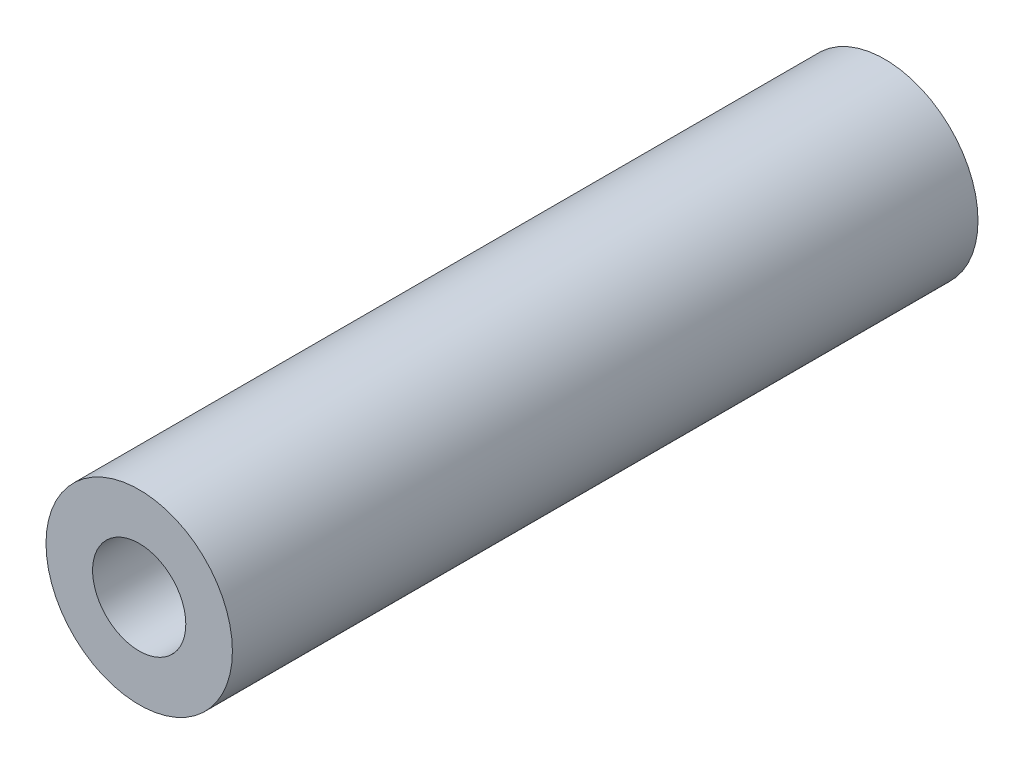
ISO-10303-21;
HEADER;
FILE_DESCRIPTION(('STEP AP214'),'2;1');
FILE_NAME('part.step','',(''),(''),'','','');
FILE_SCHEMA(('AUTOMOTIVE_DESIGN { 1 0 10303 214 1 1 1 1 }'));
ENDSEC;
DATA;
#1=APPLICATION_CONTEXT('core data for automotive mechanical design processes');
#2=APPLICATION_PROTOCOL_DEFINITION('international standard','automotive_design',2000,#1);
#3=PRODUCT_CONTEXT('',#1,'mechanical');
#4=PRODUCT('Part','Part','',(#3));
#5=PRODUCT_RELATED_PRODUCT_CATEGORY('part','',(#4));
#6=PRODUCT_DEFINITION_FORMATION('','',#4);
#7=PRODUCT_DEFINITION_CONTEXT('part definition',#1,'design');
#8=PRODUCT_DEFINITION('design','',#6,#7);
#9=PRODUCT_DEFINITION_SHAPE('','',#8);
#10=(LENGTH_UNIT() NAMED_UNIT(*) SI_UNIT(.MILLI.,.METRE.));
#11=(NAMED_UNIT(*) PLANE_ANGLE_UNIT() SI_UNIT($,.RADIAN.));
#12=(NAMED_UNIT(*) SI_UNIT($,.STERADIAN.) SOLID_ANGLE_UNIT());
#13=UNCERTAINTY_MEASURE_WITH_UNIT(LENGTH_MEASURE(1.E-05),#10,'distance_accuracy_value','');
#14=(GEOMETRIC_REPRESENTATION_CONTEXT(3) GLOBAL_UNCERTAINTY_ASSIGNED_CONTEXT((#13)) GLOBAL_UNIT_ASSIGNED_CONTEXT((#10,
#11,#12)) REPRESENTATION_CONTEXT('',''));
#15=CARTESIAN_POINT('',(0.,0.,0.));
#16=DIRECTION('',(0.,0.,1.));
#17=DIRECTION('',(1.,0.,0.));
#18=AXIS2_PLACEMENT_3D('',#15,#16,#17);
#19=CARTESIAN_POINT('',(0.,0.,203.2));
#20=DIRECTION('',(0.,0.,1.));
#21=DIRECTION('',(1.,0.,0.));
#22=AXIS2_PLACEMENT_3D('',#19,#20,#21);
#23=PLANE('',#22);
#24=CARTESIAN_POINT('',(0.,0.,203.2));
#25=DIRECTION('',(0.,0.,1.));
#26=DIRECTION('',(1.,0.,0.));
#27=AXIS2_PLACEMENT_3D('',#24,#25,#26);
#28=CIRCLE('',#27,25.4);
#29=CARTESIAN_POINT('',(25.4,0.,203.2));
#30=VERTEX_POINT('',#29);
#31=EDGE_CURVE('E10',#30,#30,#28,.T.);
#32=ORIENTED_EDGE('',*,*,#31,.T.);
#33=EDGE_LOOP('',(#32));
#34=FACE_BOUND('',#33,.T.);
#35=CARTESIAN_POINT('',(0.,0.,203.2));
#36=DIRECTION('',(0.,0.,1.));
#37=DIRECTION('',(1.,0.,0.));
#38=AXIS2_PLACEMENT_3D('',#35,#36,#37);
#39=CIRCLE('',#38,12.7);
#40=CARTESIAN_POINT('',(12.7,0.,203.2));
#41=VERTEX_POINT('',#40);
#42=EDGE_CURVE('E50',#41,#41,#39,.T.);
#43=ORIENTED_EDGE('',*,*,#42,.F.);
#44=EDGE_LOOP('',(#43));
#45=FACE_BOUND('',#44,.T.);
#46=ADVANCED_FACE('F39',(#34,#45),#23,.T.);
#47=CARTESIAN_POINT('',(0.,0.,0.));
#48=DIRECTION('',(0.,0.,1.));
#49=DIRECTION('',(1.,0.,0.));
#50=AXIS2_PLACEMENT_3D('',#47,#48,#49);
#51=PLANE('',#50);
#52=CARTESIAN_POINT('',(0.,0.,0.));
#53=DIRECTION('',(0.,0.,1.));
#54=DIRECTION('',(1.,0.,0.));
#55=AXIS2_PLACEMENT_3D('',#52,#53,#54);
#56=CIRCLE('',#55,25.4);
#57=CARTESIAN_POINT('',(25.4,0.,0.));
#58=VERTEX_POINT('',#57);
#59=EDGE_CURVE('E43',#58,#58,#56,.T.);
#60=ORIENTED_EDGE('',*,*,#59,.F.);
#61=EDGE_LOOP('',(#60));
#62=FACE_BOUND('',#61,.T.);
#63=CARTESIAN_POINT('',(0.,0.,0.));
#64=DIRECTION('',(0.,0.,1.));
#65=DIRECTION('',(1.,0.,0.));
#66=AXIS2_PLACEMENT_3D('',#63,#64,#65);
#67=CIRCLE('',#66,12.7);
#68=CARTESIAN_POINT('',(12.7,0.,0.));
#69=VERTEX_POINT('',#68);
#70=EDGE_CURVE('E52',#69,#69,#67,.T.);
#71=ORIENTED_EDGE('',*,*,#70,.T.);
#72=EDGE_LOOP('',(#71));
#73=FACE_BOUND('',#72,.T.);
#74=ADVANCED_FACE('F62',(#62,#73),#51,.F.);
#75=CARTESIAN_POINT('',(0.,0.,203.2));
#76=DIRECTION('',(0.,0.,-1.));
#77=DIRECTION('',(-1.,0.,0.));
#78=AXIS2_PLACEMENT_3D('',#75,#76,#77);
#79=CYLINDRICAL_SURFACE('',#78,25.4);
#80=ORIENTED_EDGE('',*,*,#31,.F.);
#81=EDGE_LOOP('',(#80));
#82=FACE_BOUND('',#81,.T.);
#83=ORIENTED_EDGE('',*,*,#59,.T.);
#84=EDGE_LOOP('',(#83));
#85=FACE_BOUND('',#84,.T.);
#86=ADVANCED_FACE('F41',(#82,#85),#79,.T.);
#87=CARTESIAN_POINT('',(0.,0.,203.2));
#88=DIRECTION('',(0.,0.,-1.));
#89=DIRECTION('',(-1.,0.,0.));
#90=AXIS2_PLACEMENT_3D('',#87,#88,#89);
#91=CYLINDRICAL_SURFACE('',#90,12.7);
#92=ORIENTED_EDGE('',*,*,#42,.T.);
#93=EDGE_LOOP('',(#92));
#94=FACE_BOUND('',#93,.T.);
#95=ORIENTED_EDGE('',*,*,#70,.F.);
#96=EDGE_LOOP('',(#95));
#97=FACE_BOUND('',#96,.T.);
#98=ADVANCED_FACE('F58',(#94,#97),#91,.F.);
#99=CLOSED_SHELL('',(#46,#74,#86,#98));
#100=MANIFOLD_SOLID_BREP('B2',#99);
#101=ADVANCED_BREP_SHAPE_REPRESENTATION('',(#18,#100),#14);
#102=SHAPE_DEFINITION_REPRESENTATION(#9,#101);
ENDSEC;
END-ISO-10303-21;
